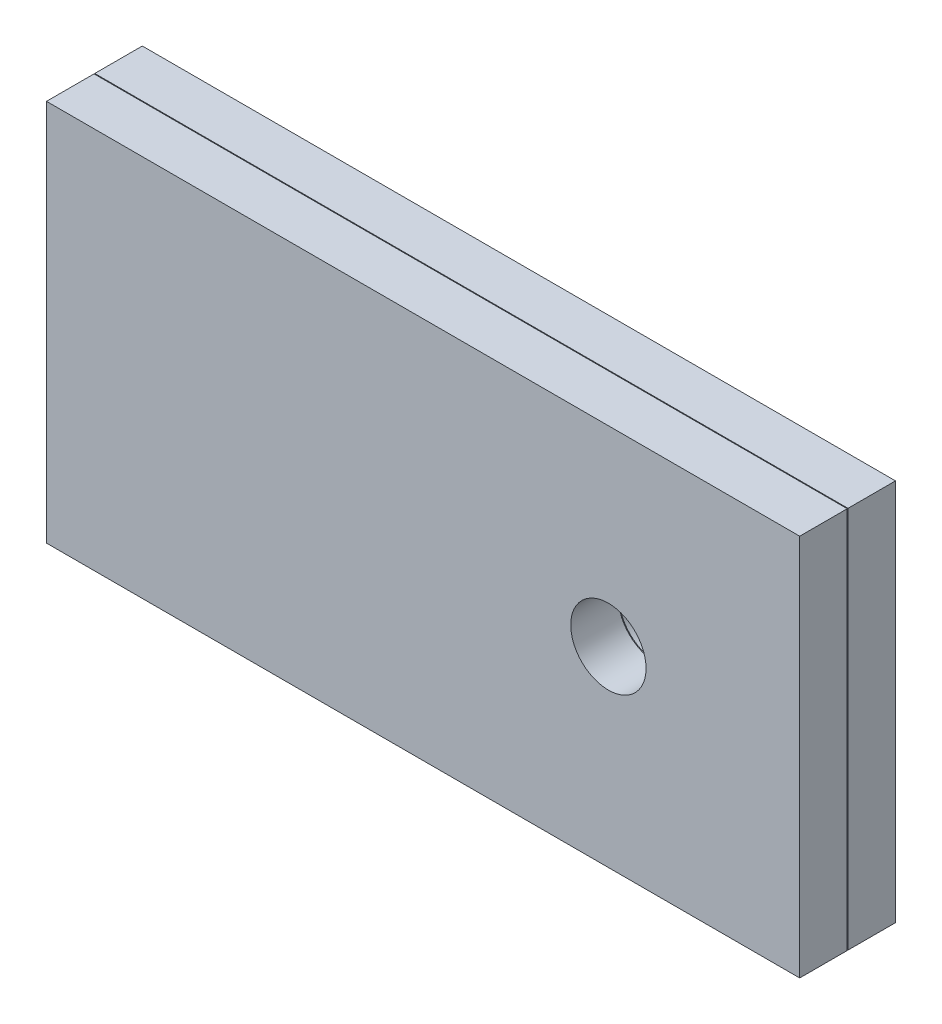
ISO-10303-21;
HEADER;
FILE_DESCRIPTION(('STEP AP214'),'2;1');
FILE_NAME('part.step','',(''),(''),'','','');
FILE_SCHEMA(('AUTOMOTIVE_DESIGN { 1 0 10303 214 1 1 1 1 }'));
ENDSEC;
DATA;
#1=APPLICATION_CONTEXT('core data for automotive mechanical design processes');
#2=APPLICATION_PROTOCOL_DEFINITION('international standard','automotive_design',2000,#1);
#3=PRODUCT_CONTEXT('',#1,'mechanical');
#4=PRODUCT('Part','Part','',(#3));
#5=PRODUCT_RELATED_PRODUCT_CATEGORY('part','',(#4));
#6=PRODUCT_DEFINITION_FORMATION('','',#4);
#7=PRODUCT_DEFINITION_CONTEXT('part definition',#1,'design');
#8=PRODUCT_DEFINITION('design','',#6,#7);
#9=PRODUCT_DEFINITION_SHAPE('','',#8);
#10=(LENGTH_UNIT() NAMED_UNIT(*) SI_UNIT(.MILLI.,.METRE.));
#11=(NAMED_UNIT(*) PLANE_ANGLE_UNIT() SI_UNIT($,.RADIAN.));
#12=(NAMED_UNIT(*) SI_UNIT($,.STERADIAN.) SOLID_ANGLE_UNIT());
#13=UNCERTAINTY_MEASURE_WITH_UNIT(LENGTH_MEASURE(1.E-05),#10,'distance_accuracy_value','');
#14=(GEOMETRIC_REPRESENTATION_CONTEXT(3) GLOBAL_UNCERTAINTY_ASSIGNED_CONTEXT((#13)) GLOBAL_UNIT_ASSIGNED_CONTEXT((#10,
#11,#12)) REPRESENTATION_CONTEXT('',''));
#15=CARTESIAN_POINT('',(0.,0.,0.));
#16=DIRECTION('',(0.,0.,1.));
#17=DIRECTION('',(1.,0.,0.));
#18=AXIS2_PLACEMENT_3D('',#15,#16,#17);
#19=CARTESIAN_POINT('',(-50.,-25.4,-6.41));
#20=DIRECTION('',(0.,0.,-1.));
#21=DIRECTION('',(0.,1.,0.));
#22=AXIS2_PLACEMENT_3D('',#19,#20,#21);
#23=PLANE('',#22);
#24=CARTESIAN_POINT('',(24.6,0.,-6.41));
#25=DIRECTION('',(0.,0.,-1.));
#26=DIRECTION('',(0.,1.,0.));
#27=AXIS2_PLACEMENT_3D('',#24,#25,#26);
#28=CIRCLE('',#27,5.);
#29=CARTESIAN_POINT('',(24.6,5.,-6.41));
#30=VERTEX_POINT('',#29);
#31=EDGE_CURVE('E149',#30,#30,#28,.T.);
#32=ORIENTED_EDGE('',*,*,#31,.F.);
#33=EDGE_LOOP('',(#32));
#34=FACE_BOUND('',#33,.T.);
#35=DIRECTION('',(0.,1.,0.));
#36=VECTOR('',#35,1.);
#37=CARTESIAN_POINT('',(50.,-25.4,-6.41));
#38=LINE('',#37,#36);
#39=CARTESIAN_POINT('',(50.,-25.4,-6.41));
#40=VERTEX_POINT('',#39);
#41=CARTESIAN_POINT('',(50.,25.4,-6.41));
#42=VERTEX_POINT('',#41);
#43=EDGE_CURVE('E109',#40,#42,#38,.T.);
#44=ORIENTED_EDGE('',*,*,#43,.F.);
#45=DIRECTION('',(1.,0.,0.));
#46=VECTOR('',#45,1.);
#47=CARTESIAN_POINT('',(-50.,-25.4,-6.41));
#48=LINE('',#47,#46);
#49=CARTESIAN_POINT('',(-50.,-25.4,-6.41));
#50=VERTEX_POINT('',#49);
#51=EDGE_CURVE('E12',#50,#40,#48,.T.);
#52=ORIENTED_EDGE('',*,*,#51,.F.);
#53=DIRECTION('',(0.,1.,0.));
#54=VECTOR('',#53,1.);
#55=CARTESIAN_POINT('',(-50.,-25.4,-6.41));
#56=LINE('',#55,#54);
#57=CARTESIAN_POINT('',(-50.,25.4,-6.41));
#58=VERTEX_POINT('',#57);
#59=EDGE_CURVE('E102',#50,#58,#56,.T.);
#60=ORIENTED_EDGE('',*,*,#59,.T.);
#61=DIRECTION('',(1.,0.,0.));
#62=VECTOR('',#61,1.);
#63=CARTESIAN_POINT('',(-50.,25.4,-6.41));
#64=LINE('',#63,#62);
#65=EDGE_CURVE('E85',#58,#42,#64,.T.);
#66=ORIENTED_EDGE('',*,*,#65,.T.);
#67=EDGE_LOOP('',(#44,#52,#60,#66));
#68=FACE_BOUND('',#67,.T.);
#69=ADVANCED_FACE('F42',(#34,#68),#23,.T.);
#70=CARTESIAN_POINT('',(-50.,-25.4,-0.1));
#71=DIRECTION('',(0.,-1.,0.));
#72=DIRECTION('',(1.,0.,0.));
#73=AXIS2_PLACEMENT_3D('',#70,#71,#72);
#74=PLANE('',#73);
#75=DIRECTION('',(0.,0.,-1.));
#76=VECTOR('',#75,1.);
#77=CARTESIAN_POINT('',(50.,-25.4,-0.1));
#78=LINE('',#77,#76);
#79=CARTESIAN_POINT('',(50.,-25.4,-0.1));
#80=VERTEX_POINT('',#79);
#81=EDGE_CURVE('E104',#80,#40,#78,.T.);
#82=ORIENTED_EDGE('',*,*,#81,.F.);
#83=DIRECTION('',(1.,0.,0.));
#84=VECTOR('',#83,1.);
#85=CARTESIAN_POINT('',(-50.,-25.4,-0.1));
#86=LINE('',#85,#84);
#87=CARTESIAN_POINT('',(-50.,-25.4,-0.1));
#88=VERTEX_POINT('',#87);
#89=EDGE_CURVE('E51',#88,#80,#86,.T.);
#90=ORIENTED_EDGE('',*,*,#89,.F.);
#91=DIRECTION('',(0.,0.,-1.));
#92=VECTOR('',#91,1.);
#93=CARTESIAN_POINT('',(-50.,-25.4,-0.1));
#94=LINE('',#93,#92);
#95=EDGE_CURVE('E99',#88,#50,#94,.T.);
#96=ORIENTED_EDGE('',*,*,#95,.T.);
#97=ORIENTED_EDGE('',*,*,#51,.T.);
#98=EDGE_LOOP('',(#82,#90,#96,#97));
#99=FACE_BOUND('',#98,.T.);
#100=ADVANCED_FACE('F119',(#99),#74,.T.);
#101=CARTESIAN_POINT('',(-50.,-25.4,-0.1));
#102=DIRECTION('',(0.,0.,1.));
#103=DIRECTION('',(1.,0.,0.));
#104=AXIS2_PLACEMENT_3D('',#101,#102,#103);
#105=PLANE('',#104);
#106=CARTESIAN_POINT('',(24.6,0.,-0.100000000000003));
#107=DIRECTION('',(0.,0.,1.));
#108=DIRECTION('',(1.,0.,0.));
#109=AXIS2_PLACEMENT_3D('',#106,#107,#108);
#110=CIRCLE('',#109,5.);
#111=CARTESIAN_POINT('',(29.6,0.,-0.100000000000003));
#112=VERTEX_POINT('',#111);
#113=EDGE_CURVE('E45',#112,#112,#110,.T.);
#114=ORIENTED_EDGE('',*,*,#113,.F.);
#115=EDGE_LOOP('',(#114));
#116=FACE_BOUND('',#115,.T.);
#117=DIRECTION('',(0.,-1.,0.));
#118=VECTOR('',#117,1.);
#119=CARTESIAN_POINT('',(50.,-25.4,-0.1));
#120=LINE('',#119,#118);
#121=CARTESIAN_POINT('',(50.,25.4,-0.1));
#122=VERTEX_POINT('',#121);
#123=EDGE_CURVE('E93',#122,#80,#120,.T.);
#124=ORIENTED_EDGE('',*,*,#123,.F.);
#125=DIRECTION('',(1.,0.,0.));
#126=VECTOR('',#125,1.);
#127=CARTESIAN_POINT('',(-50.,25.4,-0.1));
#128=LINE('',#127,#126);
#129=CARTESIAN_POINT('',(-50.,25.4,-0.1));
#130=VERTEX_POINT('',#129);
#131=EDGE_CURVE('E88',#130,#122,#128,.T.);
#132=ORIENTED_EDGE('',*,*,#131,.F.);
#133=DIRECTION('',(0.,-1.,0.));
#134=VECTOR('',#133,1.);
#135=CARTESIAN_POINT('',(-50.,-25.4,-0.1));
#136=LINE('',#135,#134);
#137=EDGE_CURVE('E91',#130,#88,#136,.T.);
#138=ORIENTED_EDGE('',*,*,#137,.T.);
#139=ORIENTED_EDGE('',*,*,#89,.T.);
#140=EDGE_LOOP('',(#124,#132,#138,#139));
#141=FACE_BOUND('',#140,.T.);
#142=ADVANCED_FACE('F90',(#116,#141),#105,.T.);
#143=CARTESIAN_POINT('',(-50.,25.4,-6.41));
#144=DIRECTION('',(0.,1.,0.));
#145=DIRECTION('',(-1.,0.,0.));
#146=AXIS2_PLACEMENT_3D('',#143,#144,#145);
#147=PLANE('',#146);
#148=DIRECTION('',(0.,0.,1.));
#149=VECTOR('',#148,1.);
#150=CARTESIAN_POINT('',(50.,25.4,-6.41));
#151=LINE('',#150,#149);
#152=EDGE_CURVE('E112',#42,#122,#151,.T.);
#153=ORIENTED_EDGE('',*,*,#152,.F.);
#154=ORIENTED_EDGE('',*,*,#65,.F.);
#155=DIRECTION('',(0.,0.,1.));
#156=VECTOR('',#155,1.);
#157=CARTESIAN_POINT('',(-50.,25.4,-6.41));
#158=LINE('',#157,#156);
#159=EDGE_CURVE('E98',#58,#130,#158,.T.);
#160=ORIENTED_EDGE('',*,*,#159,.T.);
#161=ORIENTED_EDGE('',*,*,#131,.T.);
#162=EDGE_LOOP('',(#153,#154,#160,#161));
#163=FACE_BOUND('',#162,.T.);
#164=ADVANCED_FACE('F101',(#163),#147,.T.);
#165=CARTESIAN_POINT('',(-50.,0.,0.));
#166=DIRECTION('',(1.,0.,0.));
#167=DIRECTION('',(0.,1.,0.));
#168=AXIS2_PLACEMENT_3D('',#165,#166,#167);
#169=PLANE('',#168);
#170=ORIENTED_EDGE('',*,*,#59,.F.);
#171=ORIENTED_EDGE('',*,*,#95,.F.);
#172=ORIENTED_EDGE('',*,*,#137,.F.);
#173=ORIENTED_EDGE('',*,*,#159,.F.);
#174=EDGE_LOOP('',(#170,#171,#172,#173));
#175=FACE_BOUND('',#174,.T.);
#176=ADVANCED_FACE('F97',(#175),#169,.F.);
#177=CARTESIAN_POINT('',(50.,0.,0.));
#178=DIRECTION('',(1.,0.,0.));
#179=DIRECTION('',(0.,1.,0.));
#180=AXIS2_PLACEMENT_3D('',#177,#178,#179);
#181=PLANE('',#180);
#182=ORIENTED_EDGE('',*,*,#43,.T.);
#183=ORIENTED_EDGE('',*,*,#152,.T.);
#184=ORIENTED_EDGE('',*,*,#123,.T.);
#185=ORIENTED_EDGE('',*,*,#81,.T.);
#186=EDGE_LOOP('',(#182,#183,#184,#185));
#187=FACE_BOUND('',#186,.T.);
#188=ADVANCED_FACE('F118',(#187),#181,.T.);
#189=CARTESIAN_POINT('',(24.6,0.,43.59));
#190=DIRECTION('',(0.,0.,-1.));
#191=DIRECTION('',(0.,1.,0.));
#192=AXIS2_PLACEMENT_3D('',#189,#190,#191);
#193=CYLINDRICAL_SURFACE('',#192,5.);
#194=ORIENTED_EDGE('',*,*,#113,.T.);
#195=EDGE_LOOP('',(#194));
#196=FACE_BOUND('',#195,.T.);
#197=ORIENTED_EDGE('',*,*,#31,.T.);
#198=EDGE_LOOP('',(#197));
#199=FACE_BOUND('',#198,.T.);
#200=ADVANCED_FACE('F138',(#196,#199),#193,.F.);
#201=CLOSED_SHELL('',(#69,#100,#142,#164,#176,#188,#200));
#202=MANIFOLD_SOLID_BREP('B2',#201);
#203=CARTESIAN_POINT('',(50.,25.4,6.31));
#204=DIRECTION('',(-1.,0.,0.));
#205=DIRECTION('',(0.,-1.,0.));
#206=AXIS2_PLACEMENT_3D('',#203,#204,#205);
#207=PLANE('',#206);
#208=DIRECTION('',(0.,1.,0.));
#209=VECTOR('',#208,1.);
#210=CARTESIAN_POINT('',(50.,25.4,0.));
#211=LINE('',#210,#209);
#212=CARTESIAN_POINT('',(50.,-25.4,0.));
#213=VERTEX_POINT('',#212);
#214=CARTESIAN_POINT('',(50.,25.4,0.));
#215=VERTEX_POINT('',#214);
#216=EDGE_CURVE('E251',#213,#215,#211,.T.);
#217=ORIENTED_EDGE('',*,*,#216,.T.);
#218=DIRECTION('',(0.,0.,-1.));
#219=VECTOR('',#218,1.);
#220=CARTESIAN_POINT('',(50.,25.4,6.31));
#221=LINE('',#220,#219);
#222=CARTESIAN_POINT('',(50.,25.4,6.31));
#223=VERTEX_POINT('',#222);
#224=EDGE_CURVE('E40',#223,#215,#221,.T.);
#225=ORIENTED_EDGE('',*,*,#224,.F.);
#226=DIRECTION('',(0.,1.,0.));
#227=VECTOR('',#226,1.);
#228=CARTESIAN_POINT('',(50.,25.4,6.31));
#229=LINE('',#228,#227);
#230=CARTESIAN_POINT('',(50.,-25.4,6.31));
#231=VERTEX_POINT('',#230);
#232=EDGE_CURVE('E238',#231,#223,#229,.T.);
#233=ORIENTED_EDGE('',*,*,#232,.F.);
#234=DIRECTION('',(0.,0.,-1.));
#235=VECTOR('',#234,1.);
#236=CARTESIAN_POINT('',(50.,-25.4,6.31));
#237=LINE('',#236,#235);
#238=EDGE_CURVE('E247',#231,#213,#237,.T.);
#239=ORIENTED_EDGE('',*,*,#238,.T.);
#240=EDGE_LOOP('',(#217,#225,#233,#239));
#241=FACE_BOUND('',#240,.T.);
#242=ADVANCED_FACE('F186',(#241),#207,.F.);
#243=CARTESIAN_POINT('',(-50.,25.4,6.31));
#244=DIRECTION('',(0.,-1.,0.));
#245=DIRECTION('',(0.,0.,-1.));
#246=AXIS2_PLACEMENT_3D('',#243,#244,#245);
#247=PLANE('',#246);
#248=DIRECTION('',(-1.,0.,0.));
#249=VECTOR('',#248,1.);
#250=CARTESIAN_POINT('',(-50.,25.4,0.));
#251=LINE('',#250,#249);
#252=CARTESIAN_POINT('',(-50.,25.4,0.));
#253=VERTEX_POINT('',#252);
#254=EDGE_CURVE('E242',#215,#253,#251,.T.);
#255=ORIENTED_EDGE('',*,*,#254,.T.);
#256=DIRECTION('',(0.,0.,-1.));
#257=VECTOR('',#256,1.);
#258=CARTESIAN_POINT('',(-50.,25.4,6.31));
#259=LINE('',#258,#257);
#260=CARTESIAN_POINT('',(-50.,25.4,6.31));
#261=VERTEX_POINT('',#260);
#262=EDGE_CURVE('E195',#261,#253,#259,.T.);
#263=ORIENTED_EDGE('',*,*,#262,.F.);
#264=DIRECTION('',(-1.,0.,0.));
#265=VECTOR('',#264,1.);
#266=CARTESIAN_POINT('',(-50.,25.4,6.31));
#267=LINE('',#266,#265);
#268=EDGE_CURVE('E233',#223,#261,#267,.T.);
#269=ORIENTED_EDGE('',*,*,#268,.F.);
#270=ORIENTED_EDGE('',*,*,#224,.T.);
#271=EDGE_LOOP('',(#255,#263,#269,#270));
#272=FACE_BOUND('',#271,.T.);
#273=ADVANCED_FACE('F241',(#272),#247,.F.);
#274=CARTESIAN_POINT('',(-50.,25.4,6.31));
#275=DIRECTION('',(1.,0.,0.));
#276=DIRECTION('',(0.,0.,-1.));
#277=AXIS2_PLACEMENT_3D('',#274,#275,#276);
#278=PLANE('',#277);
#279=DIRECTION('',(0.,-1.,0.));
#280=VECTOR('',#279,1.);
#281=CARTESIAN_POINT('',(-50.,25.4,0.));
#282=LINE('',#281,#280);
#283=CARTESIAN_POINT('',(-50.,-25.4,0.));
#284=VERTEX_POINT('',#283);
#285=EDGE_CURVE('E220',#253,#284,#282,.T.);
#286=ORIENTED_EDGE('',*,*,#285,.T.);
#287=DIRECTION('',(0.,0.,-1.));
#288=VECTOR('',#287,1.);
#289=CARTESIAN_POINT('',(-50.,-25.4,6.31));
#290=LINE('',#289,#288);
#291=CARTESIAN_POINT('',(-50.,-25.4,6.31));
#292=VERTEX_POINT('',#291);
#293=EDGE_CURVE('E243',#292,#284,#290,.T.);
#294=ORIENTED_EDGE('',*,*,#293,.F.);
#295=DIRECTION('',(0.,-1.,0.));
#296=VECTOR('',#295,1.);
#297=CARTESIAN_POINT('',(-50.,25.4,6.31));
#298=LINE('',#297,#296);
#299=EDGE_CURVE('E236',#261,#292,#298,.T.);
#300=ORIENTED_EDGE('',*,*,#299,.F.);
#301=ORIENTED_EDGE('',*,*,#262,.T.);
#302=EDGE_LOOP('',(#286,#294,#300,#301));
#303=FACE_BOUND('',#302,.T.);
#304=ADVANCED_FACE('F245',(#303),#278,.F.);
#305=CARTESIAN_POINT('',(-50.,-25.4,6.31));
#306=DIRECTION('',(0.,1.,0.));
#307=DIRECTION('',(0.,0.,1.));
#308=AXIS2_PLACEMENT_3D('',#305,#306,#307);
#309=PLANE('',#308);
#310=DIRECTION('',(1.,0.,0.));
#311=VECTOR('',#310,1.);
#312=CARTESIAN_POINT('',(-50.,-25.4,0.));
#313=LINE('',#312,#311);
#314=EDGE_CURVE('E226',#284,#213,#313,.T.);
#315=ORIENTED_EDGE('',*,*,#314,.T.);
#316=ORIENTED_EDGE('',*,*,#238,.F.);
#317=DIRECTION('',(1.,0.,0.));
#318=VECTOR('',#317,1.);
#319=CARTESIAN_POINT('',(-50.,-25.4,6.31));
#320=LINE('',#319,#318);
#321=EDGE_CURVE('E203',#292,#231,#320,.T.);
#322=ORIENTED_EDGE('',*,*,#321,.F.);
#323=ORIENTED_EDGE('',*,*,#293,.T.);
#324=EDGE_LOOP('',(#315,#316,#322,#323));
#325=FACE_BOUND('',#324,.T.);
#326=ADVANCED_FACE('F259',(#325),#309,.F.);
#327=CARTESIAN_POINT('',(0.,0.,6.31));
#328=DIRECTION('',(0.,0.,1.));
#329=DIRECTION('',(1.,0.,0.));
#330=AXIS2_PLACEMENT_3D('',#327,#328,#329);
#331=PLANE('',#330);
#332=CARTESIAN_POINT('',(24.6,0.,6.31));
#333=DIRECTION('',(0.,0.,1.));
#334=DIRECTION('',(1.,0.,0.));
#335=AXIS2_PLACEMENT_3D('',#332,#333,#334);
#336=CIRCLE('',#335,5.);
#337=CARTESIAN_POINT('',(29.6,0.,6.31));
#338=VERTEX_POINT('',#337);
#339=EDGE_CURVE('E254',#338,#338,#336,.T.);
#340=ORIENTED_EDGE('',*,*,#339,.F.);
#341=EDGE_LOOP('',(#340));
#342=FACE_BOUND('',#341,.T.);
#343=ORIENTED_EDGE('',*,*,#232,.T.);
#344=ORIENTED_EDGE('',*,*,#268,.T.);
#345=ORIENTED_EDGE('',*,*,#299,.T.);
#346=ORIENTED_EDGE('',*,*,#321,.T.);
#347=EDGE_LOOP('',(#343,#344,#345,#346));
#348=FACE_BOUND('',#347,.T.);
#349=ADVANCED_FACE('F234',(#342,#348),#331,.T.);
#350=CARTESIAN_POINT('',(0.,0.,0.));
#351=DIRECTION('',(0.,0.,1.));
#352=DIRECTION('',(1.,0.,0.));
#353=AXIS2_PLACEMENT_3D('',#350,#351,#352);
#354=PLANE('',#353);
#355=CARTESIAN_POINT('',(24.6,0.,0.));
#356=DIRECTION('',(0.,0.,1.));
#357=DIRECTION('',(1.,0.,0.));
#358=AXIS2_PLACEMENT_3D('',#355,#356,#357);
#359=CIRCLE('',#358,5.);
#360=CARTESIAN_POINT('',(29.6,0.,0.));
#361=VERTEX_POINT('',#360);
#362=EDGE_CURVE('E189',#361,#361,#359,.T.);
#363=ORIENTED_EDGE('',*,*,#362,.T.);
#364=EDGE_LOOP('',(#363));
#365=FACE_BOUND('',#364,.T.);
#366=ORIENTED_EDGE('',*,*,#216,.F.);
#367=ORIENTED_EDGE('',*,*,#314,.F.);
#368=ORIENTED_EDGE('',*,*,#285,.F.);
#369=ORIENTED_EDGE('',*,*,#254,.F.);
#370=EDGE_LOOP('',(#366,#367,#368,#369));
#371=FACE_BOUND('',#370,.T.);
#372=ADVANCED_FACE('F262',(#365,#371),#354,.F.);
#373=CARTESIAN_POINT('',(24.6,0.,43.59));
#374=DIRECTION('',(0.,0.,-1.));
#375=DIRECTION('',(0.,1.,0.));
#376=AXIS2_PLACEMENT_3D('',#373,#374,#375);
#377=CYLINDRICAL_SURFACE('',#376,5.);
#378=ORIENTED_EDGE('',*,*,#339,.T.);
#379=EDGE_LOOP('',(#378));
#380=FACE_BOUND('',#379,.T.);
#381=ORIENTED_EDGE('',*,*,#362,.F.);
#382=EDGE_LOOP('',(#381));
#383=FACE_BOUND('',#382,.T.);
#384=ADVANCED_FACE('F272',(#380,#383),#377,.F.);
#385=CLOSED_SHELL('',(#242,#273,#304,#326,#349,#372,#384));
#386=MANIFOLD_SOLID_BREP('B6',#385);
#387=ADVANCED_BREP_SHAPE_REPRESENTATION('',(#18,#202,#386),#14);
#388=SHAPE_DEFINITION_REPRESENTATION(#9,#387);
ENDSEC;
END-ISO-10303-21;
